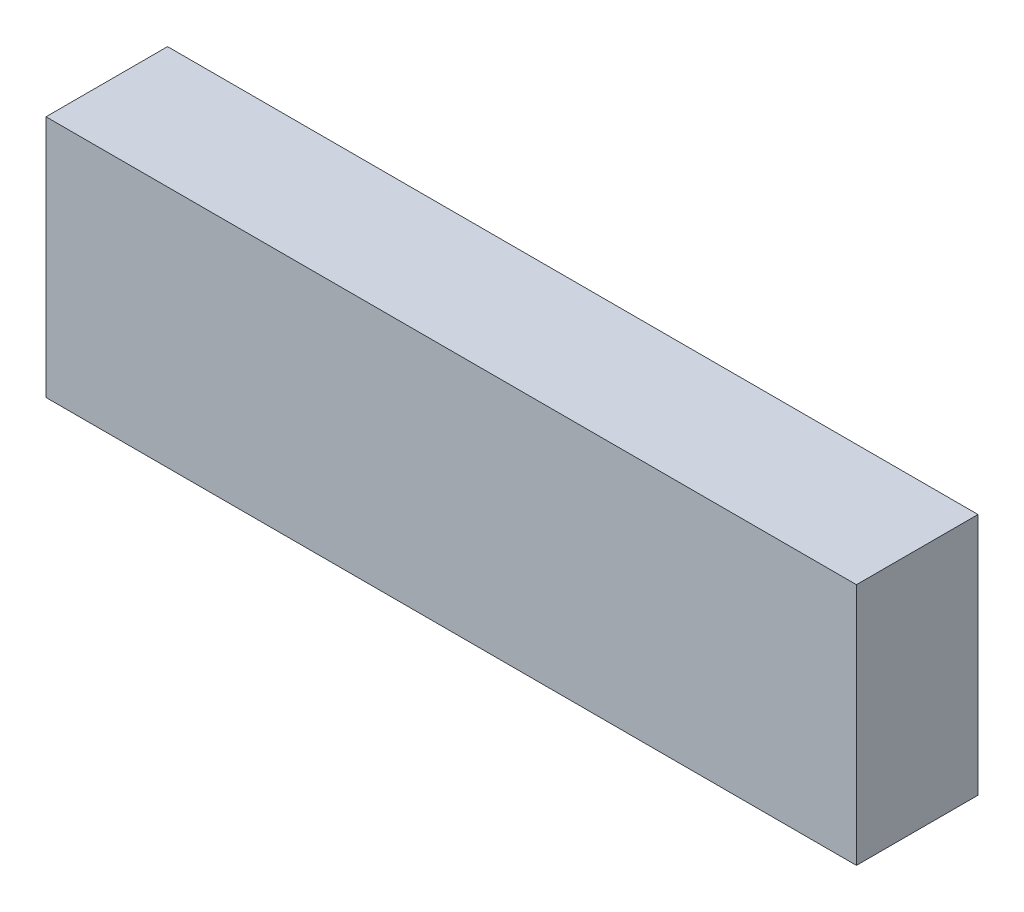
ISO-10303-21;
HEADER;
FILE_DESCRIPTION(('STEP AP214'),'2;1');
FILE_NAME('part.step','',(''),(''),'','','');
FILE_SCHEMA(('AUTOMOTIVE_DESIGN { 1 0 10303 214 1 1 1 1 }'));
ENDSEC;
DATA;
#1=APPLICATION_CONTEXT('core data for automotive mechanical design processes');
#2=APPLICATION_PROTOCOL_DEFINITION('international standard','automotive_design',2000,#1);
#3=PRODUCT_CONTEXT('',#1,'mechanical');
#4=PRODUCT('Part','Part','',(#3));
#5=PRODUCT_RELATED_PRODUCT_CATEGORY('part','',(#4));
#6=PRODUCT_DEFINITION_FORMATION('','',#4);
#7=PRODUCT_DEFINITION_CONTEXT('part definition',#1,'design');
#8=PRODUCT_DEFINITION('design','',#6,#7);
#9=PRODUCT_DEFINITION_SHAPE('','',#8);
#10=(LENGTH_UNIT() NAMED_UNIT(*) SI_UNIT(.MILLI.,.METRE.));
#11=(NAMED_UNIT(*) PLANE_ANGLE_UNIT() SI_UNIT($,.RADIAN.));
#12=(NAMED_UNIT(*) SI_UNIT($,.STERADIAN.) SOLID_ANGLE_UNIT());
#13=UNCERTAINTY_MEASURE_WITH_UNIT(LENGTH_MEASURE(1.E-05),#10,'distance_accuracy_value','');
#14=(GEOMETRIC_REPRESENTATION_CONTEXT(3) GLOBAL_UNCERTAINTY_ASSIGNED_CONTEXT((#13)) GLOBAL_UNIT_ASSIGNED_CONTEXT((#10,
#11,#12)) REPRESENTATION_CONTEXT('',''));
#15=CARTESIAN_POINT('',(0.,0.,0.));
#16=DIRECTION('',(0.,0.,1.));
#17=DIRECTION('',(1.,0.,0.));
#18=AXIS2_PLACEMENT_3D('',#15,#16,#17);
#19=CARTESIAN_POINT('',(0.,0.,150.));
#20=DIRECTION('',(1.,0.,0.));
#21=DIRECTION('',(0.,0.,-1.));
#22=AXIS2_PLACEMENT_3D('',#19,#20,#21);
#23=PLANE('',#22);
#24=DIRECTION('',(0.,-1.,0.));
#25=VECTOR('',#24,1.);
#26=CARTESIAN_POINT('',(0.,0.,0.));
#27=LINE('',#26,#25);
#28=CARTESIAN_POINT('',(0.,300.,0.));
#29=VERTEX_POINT('',#28);
#30=CARTESIAN_POINT('',(0.,0.,0.));
#31=VERTEX_POINT('',#30);
#32=EDGE_CURVE('E99',#29,#31,#27,.T.);
#33=ORIENTED_EDGE('',*,*,#32,.T.);
#34=DIRECTION('',(0.,0.,-1.));
#35=VECTOR('',#34,1.);
#36=CARTESIAN_POINT('',(0.,0.,150.));
#37=LINE('',#36,#35);
#38=CARTESIAN_POINT('',(0.,0.,150.));
#39=VERTEX_POINT('',#38);
#40=EDGE_CURVE('E11',#39,#31,#37,.T.);
#41=ORIENTED_EDGE('',*,*,#40,.F.);
#42=DIRECTION('',(0.,-1.,0.));
#43=VECTOR('',#42,1.);
#44=CARTESIAN_POINT('',(0.,0.,150.));
#45=LINE('',#44,#43);
#46=CARTESIAN_POINT('',(0.,300.,150.));
#47=VERTEX_POINT('',#46);
#48=EDGE_CURVE('E87',#47,#39,#45,.T.);
#49=ORIENTED_EDGE('',*,*,#48,.F.);
#50=DIRECTION('',(0.,0.,-1.));
#51=VECTOR('',#50,1.);
#52=CARTESIAN_POINT('',(0.,300.,150.));
#53=LINE('',#52,#51);
#54=EDGE_CURVE('E95',#47,#29,#53,.T.);
#55=ORIENTED_EDGE('',*,*,#54,.T.);
#56=EDGE_LOOP('',(#33,#41,#49,#55));
#57=FACE_BOUND('',#56,.T.);
#58=ADVANCED_FACE('F36',(#57),#23,.F.);
#59=CARTESIAN_POINT('',(0.,0.,150.));
#60=DIRECTION('',(0.,1.,0.));
#61=DIRECTION('',(0.,0.,1.));
#62=AXIS2_PLACEMENT_3D('',#59,#60,#61);
#63=PLANE('',#62);
#64=DIRECTION('',(1.,0.,0.));
#65=VECTOR('',#64,1.);
#66=CARTESIAN_POINT('',(0.,0.,0.));
#67=LINE('',#66,#65);
#68=CARTESIAN_POINT('',(1000.,0.,0.));
#69=VERTEX_POINT('',#68);
#70=EDGE_CURVE('E91',#31,#69,#67,.T.);
#71=ORIENTED_EDGE('',*,*,#70,.T.);
#72=DIRECTION('',(0.,0.,-1.));
#73=VECTOR('',#72,1.);
#74=CARTESIAN_POINT('',(1000.,0.,150.));
#75=LINE('',#74,#73);
#76=CARTESIAN_POINT('',(1000.,0.,150.));
#77=VERTEX_POINT('',#76);
#78=EDGE_CURVE('E44',#77,#69,#75,.T.);
#79=ORIENTED_EDGE('',*,*,#78,.F.);
#80=DIRECTION('',(1.,0.,0.));
#81=VECTOR('',#80,1.);
#82=CARTESIAN_POINT('',(0.,0.,150.));
#83=LINE('',#82,#81);
#84=EDGE_CURVE('E82',#39,#77,#83,.T.);
#85=ORIENTED_EDGE('',*,*,#84,.F.);
#86=ORIENTED_EDGE('',*,*,#40,.T.);
#87=EDGE_LOOP('',(#71,#79,#85,#86));
#88=FACE_BOUND('',#87,.T.);
#89=ADVANCED_FACE('F90',(#88),#63,.F.);
#90=CARTESIAN_POINT('',(1000.,0.,150.));
#91=DIRECTION('',(-1.,0.,0.));
#92=DIRECTION('',(0.,0.,1.));
#93=AXIS2_PLACEMENT_3D('',#90,#91,#92);
#94=PLANE('',#93);
#95=DIRECTION('',(0.,1.,0.));
#96=VECTOR('',#95,1.);
#97=CARTESIAN_POINT('',(1000.,0.,0.));
#98=LINE('',#97,#96);
#99=CARTESIAN_POINT('',(1000.,300.,0.));
#100=VERTEX_POINT('',#99);
#101=EDGE_CURVE('E69',#69,#100,#98,.T.);
#102=ORIENTED_EDGE('',*,*,#101,.T.);
#103=DIRECTION('',(0.,0.,-1.));
#104=VECTOR('',#103,1.);
#105=CARTESIAN_POINT('',(1000.,300.,150.));
#106=LINE('',#105,#104);
#107=CARTESIAN_POINT('',(1000.,300.,150.));
#108=VERTEX_POINT('',#107);
#109=EDGE_CURVE('E92',#108,#100,#106,.T.);
#110=ORIENTED_EDGE('',*,*,#109,.F.);
#111=DIRECTION('',(0.,1.,0.));
#112=VECTOR('',#111,1.);
#113=CARTESIAN_POINT('',(1000.,0.,150.));
#114=LINE('',#113,#112);
#115=EDGE_CURVE('E85',#77,#108,#114,.T.);
#116=ORIENTED_EDGE('',*,*,#115,.F.);
#117=ORIENTED_EDGE('',*,*,#78,.T.);
#118=EDGE_LOOP('',(#102,#110,#116,#117));
#119=FACE_BOUND('',#118,.T.);
#120=ADVANCED_FACE('F93',(#119),#94,.F.);
#121=CARTESIAN_POINT('',(0.,300.,150.));
#122=DIRECTION('',(0.,-1.,0.));
#123=DIRECTION('',(0.,0.,-1.));
#124=AXIS2_PLACEMENT_3D('',#121,#122,#123);
#125=PLANE('',#124);
#126=DIRECTION('',(-1.,0.,0.));
#127=VECTOR('',#126,1.);
#128=CARTESIAN_POINT('',(0.,300.,0.));
#129=LINE('',#128,#127);
#130=EDGE_CURVE('E75',#100,#29,#129,.T.);
#131=ORIENTED_EDGE('',*,*,#130,.T.);
#132=ORIENTED_EDGE('',*,*,#54,.F.);
#133=DIRECTION('',(-1.,0.,0.));
#134=VECTOR('',#133,1.);
#135=CARTESIAN_POINT('',(0.,300.,150.));
#136=LINE('',#135,#134);
#137=EDGE_CURVE('E52',#108,#47,#136,.T.);
#138=ORIENTED_EDGE('',*,*,#137,.F.);
#139=ORIENTED_EDGE('',*,*,#109,.T.);
#140=EDGE_LOOP('',(#131,#132,#138,#139));
#141=FACE_BOUND('',#140,.T.);
#142=ADVANCED_FACE('F106',(#141),#125,.F.);
#143=CARTESIAN_POINT('',(0.,0.,150.));
#144=DIRECTION('',(0.,0.,-1.));
#145=DIRECTION('',(-1.,0.,0.));
#146=AXIS2_PLACEMENT_3D('',#143,#144,#145);
#147=PLANE('',#146);
#148=ORIENTED_EDGE('',*,*,#48,.T.);
#149=ORIENTED_EDGE('',*,*,#84,.T.);
#150=ORIENTED_EDGE('',*,*,#115,.T.);
#151=ORIENTED_EDGE('',*,*,#137,.T.);
#152=EDGE_LOOP('',(#148,#149,#150,#151));
#153=FACE_BOUND('',#152,.T.);
#154=ADVANCED_FACE('F83',(#153),#147,.F.);
#155=CARTESIAN_POINT('',(0.,0.,0.));
#156=DIRECTION('',(0.,0.,-1.));
#157=DIRECTION('',(-1.,0.,0.));
#158=AXIS2_PLACEMENT_3D('',#155,#156,#157);
#159=PLANE('',#158);
#160=ORIENTED_EDGE('',*,*,#32,.F.);
#161=ORIENTED_EDGE('',*,*,#130,.F.);
#162=ORIENTED_EDGE('',*,*,#101,.F.);
#163=ORIENTED_EDGE('',*,*,#70,.F.);
#164=EDGE_LOOP('',(#160,#161,#162,#163));
#165=FACE_BOUND('',#164,.T.);
#166=ADVANCED_FACE('F109',(#165),#159,.T.);
#167=CLOSED_SHELL('',(#58,#89,#120,#142,#154,#166));
#168=MANIFOLD_SOLID_BREP('B2',#167);
#169=ADVANCED_BREP_SHAPE_REPRESENTATION('',(#18,#168),#14);
#170=SHAPE_DEFINITION_REPRESENTATION(#9,#169);
ENDSEC;
END-ISO-10303-21;
